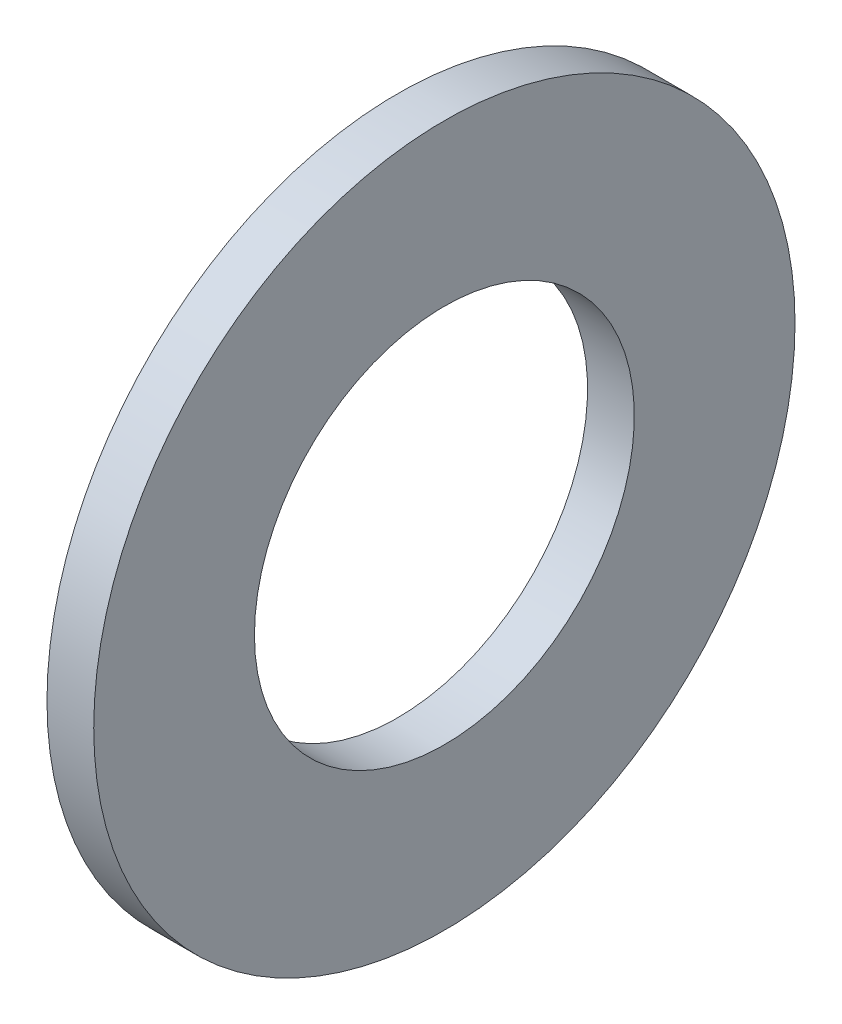
ISO-10303-21;
HEADER;
FILE_DESCRIPTION(('STEP AP214'),'2;1');
FILE_NAME('part.step','',(''),(''),'','','');
FILE_SCHEMA(('AUTOMOTIVE_DESIGN { 1 0 10303 214 1 1 1 1 }'));
ENDSEC;
DATA;
#1=APPLICATION_CONTEXT('core data for automotive mechanical design processes');
#2=APPLICATION_PROTOCOL_DEFINITION('international standard','automotive_design',2000,#1);
#3=PRODUCT_CONTEXT('',#1,'mechanical');
#4=PRODUCT('Part','Part','',(#3));
#5=PRODUCT_RELATED_PRODUCT_CATEGORY('part','',(#4));
#6=PRODUCT_DEFINITION_FORMATION('','',#4);
#7=PRODUCT_DEFINITION_CONTEXT('part definition',#1,'design');
#8=PRODUCT_DEFINITION('design','',#6,#7);
#9=PRODUCT_DEFINITION_SHAPE('','',#8);
#10=(LENGTH_UNIT() NAMED_UNIT(*) SI_UNIT(.MILLI.,.METRE.));
#11=(NAMED_UNIT(*) PLANE_ANGLE_UNIT() SI_UNIT($,.RADIAN.));
#12=(NAMED_UNIT(*) SI_UNIT($,.STERADIAN.) SOLID_ANGLE_UNIT());
#13=UNCERTAINTY_MEASURE_WITH_UNIT(LENGTH_MEASURE(1.E-05),#10,'distance_accuracy_value','');
#14=(GEOMETRIC_REPRESENTATION_CONTEXT(3) GLOBAL_UNCERTAINTY_ASSIGNED_CONTEXT((#13)) GLOBAL_UNIT_ASSIGNED_CONTEXT((#10,
#11,#12)) REPRESENTATION_CONTEXT('',''));
#15=CARTESIAN_POINT('',(0.,0.,0.));
#16=DIRECTION('',(0.,0.,1.));
#17=DIRECTION('',(1.,0.,0.));
#18=AXIS2_PLACEMENT_3D('',#15,#16,#17);
#19=CARTESIAN_POINT('',(-34.9249999999999,0.,0.));
#20=DIRECTION('',(-1.,0.,0.));
#21=DIRECTION('',(0.,0.,1.));
#22=AXIS2_PLACEMENT_3D('',#19,#20,#21);
#23=CYLINDRICAL_SURFACE('',#22,3.25);
#24=CARTESIAN_POINT('',(0.,0.,0.));
#25=DIRECTION('',(-1.,0.,0.));
#26=DIRECTION('',(0.,0.,1.));
#27=AXIS2_PLACEMENT_3D('',#24,#25,#26);
#28=CIRCLE('',#27,3.25);
#29=CARTESIAN_POINT('',(0.,0.,3.25));
#30=VERTEX_POINT('',#29);
#31=EDGE_CURVE('E10',#30,#30,#28,.T.);
#32=ORIENTED_EDGE('',*,*,#31,.F.);
#33=EDGE_LOOP('',(#32));
#34=FACE_BOUND('',#33,.T.);
#35=CARTESIAN_POINT('',(-0.800000000000002,0.,0.));
#36=DIRECTION('',(-1.,0.,0.));
#37=DIRECTION('',(0.,0.,1.));
#38=AXIS2_PLACEMENT_3D('',#35,#36,#37);
#39=CIRCLE('',#38,3.25);
#40=CARTESIAN_POINT('',(-0.800000000000002,0.,3.25));
#41=VERTEX_POINT('',#40);
#42=EDGE_CURVE('E44',#41,#41,#39,.T.);
#43=ORIENTED_EDGE('',*,*,#42,.T.);
#44=EDGE_LOOP('',(#43));
#45=FACE_BOUND('',#44,.T.);
#46=ADVANCED_FACE('F30',(#34,#45),#23,.F.);
#47=CARTESIAN_POINT('',(0.,3.25,0.));
#48=DIRECTION('',(-1.,0.,0.));
#49=DIRECTION('',(0.,0.,1.));
#50=AXIS2_PLACEMENT_3D('',#47,#48,#49);
#51=PLANE('',#50);
#52=CARTESIAN_POINT('',(0.,0.,0.));
#53=DIRECTION('',(-1.,0.,0.));
#54=DIRECTION('',(0.,0.,1.));
#55=AXIS2_PLACEMENT_3D('',#52,#53,#54);
#56=CIRCLE('',#55,6.);
#57=CARTESIAN_POINT('',(0.,0.,6.));
#58=VERTEX_POINT('',#57);
#59=EDGE_CURVE('E36',#58,#58,#56,.T.);
#60=ORIENTED_EDGE('',*,*,#59,.F.);
#61=EDGE_LOOP('',(#60));
#62=FACE_BOUND('',#61,.T.);
#63=ORIENTED_EDGE('',*,*,#31,.T.);
#64=EDGE_LOOP('',(#63));
#65=FACE_BOUND('',#64,.T.);
#66=ADVANCED_FACE('F59',(#62,#65),#51,.F.);
#67=CARTESIAN_POINT('',(-34.9249999999999,0.,0.));
#68=DIRECTION('',(-1.,0.,0.));
#69=DIRECTION('',(0.,0.,1.));
#70=AXIS2_PLACEMENT_3D('',#67,#68,#69);
#71=CYLINDRICAL_SURFACE('',#70,6.);
#72=CARTESIAN_POINT('',(-0.800000000000002,0.,0.));
#73=DIRECTION('',(-1.,0.,0.));
#74=DIRECTION('',(0.,0.,1.));
#75=AXIS2_PLACEMENT_3D('',#72,#73,#74);
#76=CIRCLE('',#75,6.);
#77=CARTESIAN_POINT('',(-0.800000000000002,0.,6.));
#78=VERTEX_POINT('',#77);
#79=EDGE_CURVE('E40',#78,#78,#76,.T.);
#80=ORIENTED_EDGE('',*,*,#79,.F.);
#81=EDGE_LOOP('',(#80));
#82=FACE_BOUND('',#81,.T.);
#83=ORIENTED_EDGE('',*,*,#59,.T.);
#84=EDGE_LOOP('',(#83));
#85=FACE_BOUND('',#84,.T.);
#86=ADVANCED_FACE('F54',(#82,#85),#71,.T.);
#87=CARTESIAN_POINT('',(-0.800000000000001,6.,0.));
#88=DIRECTION('',(1.,0.,0.));
#89=DIRECTION('',(0.,0.,-1.));
#90=AXIS2_PLACEMENT_3D('',#87,#88,#89);
#91=PLANE('',#90);
#92=ORIENTED_EDGE('',*,*,#42,.F.);
#93=EDGE_LOOP('',(#92));
#94=FACE_BOUND('',#93,.T.);
#95=ORIENTED_EDGE('',*,*,#79,.T.);
#96=EDGE_LOOP('',(#95));
#97=FACE_BOUND('',#96,.T.);
#98=ADVANCED_FACE('F51',(#94,#97),#91,.F.);
#99=CLOSED_SHELL('',(#46,#66,#86,#98));
#100=MANIFOLD_SOLID_BREP('B2',#99);
#101=ADVANCED_BREP_SHAPE_REPRESENTATION('',(#18,#100),#14);
#102=SHAPE_DEFINITION_REPRESENTATION(#9,#101);
ENDSEC;
END-ISO-10303-21;
